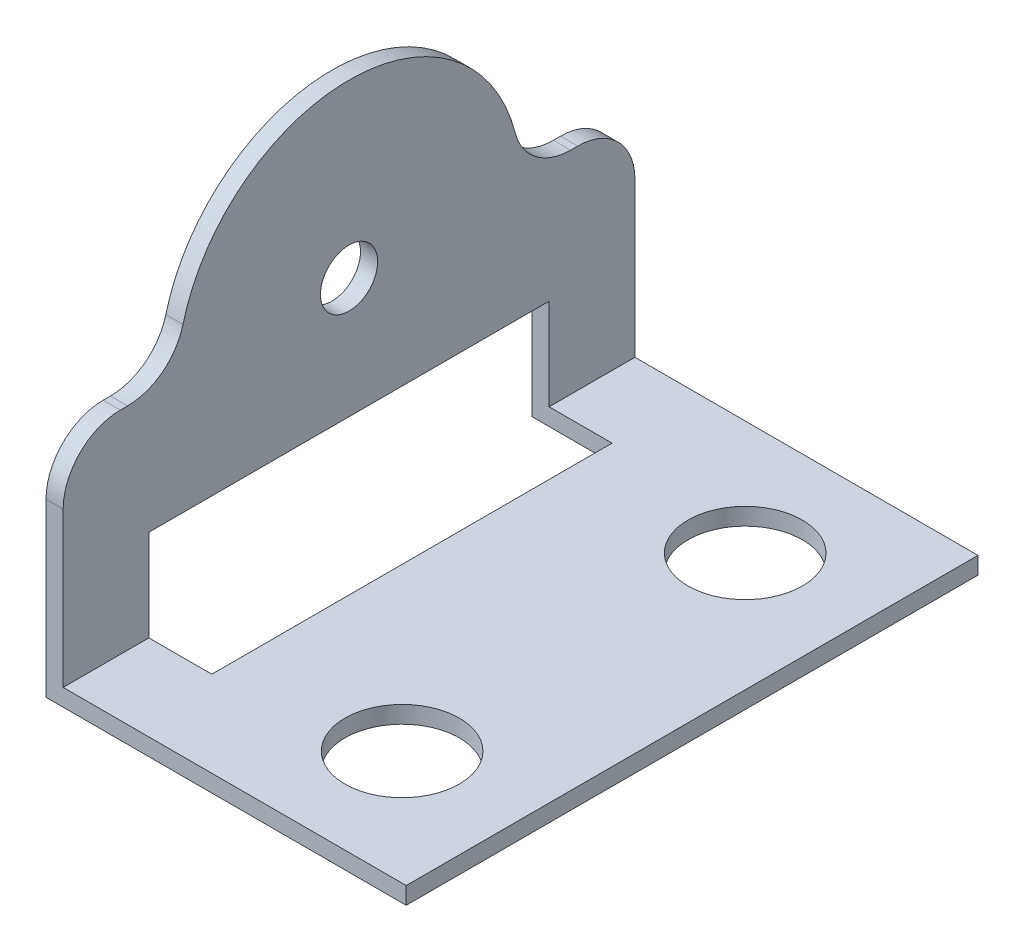
ISO-10303-21;
HEADER;
FILE_DESCRIPTION(('STEP AP214'),'2;1');
FILE_NAME('part.step','',(''),(''),'','','');
FILE_SCHEMA(('AUTOMOTIVE_DESIGN { 1 0 10303 214 1 1 1 1 }'));
ENDSEC;
DATA;
#1=APPLICATION_CONTEXT('core data for automotive mechanical design processes');
#2=APPLICATION_PROTOCOL_DEFINITION('international standard','automotive_design',2000,#1);
#3=PRODUCT_CONTEXT('',#1,'mechanical');
#4=PRODUCT('Part','Part','',(#3));
#5=PRODUCT_RELATED_PRODUCT_CATEGORY('part','',(#4));
#6=PRODUCT_DEFINITION_FORMATION('','',#4);
#7=PRODUCT_DEFINITION_CONTEXT('part definition',#1,'design');
#8=PRODUCT_DEFINITION('design','',#6,#7);
#9=PRODUCT_DEFINITION_SHAPE('','',#8);
#10=(LENGTH_UNIT() NAMED_UNIT(*) SI_UNIT(.MILLI.,.METRE.));
#11=(NAMED_UNIT(*) PLANE_ANGLE_UNIT() SI_UNIT($,.RADIAN.));
#12=(NAMED_UNIT(*) SI_UNIT($,.STERADIAN.) SOLID_ANGLE_UNIT());
#13=UNCERTAINTY_MEASURE_WITH_UNIT(LENGTH_MEASURE(1.E-05),#10,'distance_accuracy_value','');
#14=(GEOMETRIC_REPRESENTATION_CONTEXT(3) GLOBAL_UNCERTAINTY_ASSIGNED_CONTEXT((#13)) GLOBAL_UNIT_ASSIGNED_CONTEXT((#10,
#11,#12)) REPRESENTATION_CONTEXT('',''));
#15=CARTESIAN_POINT('',(0.,0.,0.));
#16=DIRECTION('',(0.,0.,1.));
#17=DIRECTION('',(1.,0.,0.));
#18=AXIS2_PLACEMENT_3D('',#15,#16,#17);
#19=CARTESIAN_POINT('',(0.,0.,0.));
#20=DIRECTION('',(1.,0.,0.));
#21=DIRECTION('',(0.,0.,-1.));
#22=AXIS2_PLACEMENT_3D('',#19,#20,#21);
#23=PLANE('',#22);
#24=CARTESIAN_POINT('',(0.,0.,0.));
#25=DIRECTION('',(1.,0.,0.));
#26=DIRECTION('',(0.,0.,-1.));
#27=AXIS2_PLACEMENT_3D('',#24,#25,#26);
#28=CIRCLE('',#27,2.5);
#29=CARTESIAN_POINT('',(0.,0.,-2.5));
#30=VERTEX_POINT('',#29);
#31=EDGE_CURVE('E266',#30,#30,#28,.T.);
#32=ORIENTED_EDGE('',*,*,#31,.F.);
#33=EDGE_LOOP('',(#32));
#34=FACE_BOUND('',#33,.T.);
#35=DIRECTION('',(0.,-1.,0.));
#36=VECTOR('',#35,1.);
#37=CARTESIAN_POINT('',(0.,0.,-25.));
#38=LINE('',#37,#36);
#39=CARTESIAN_POINT('',(0.,-5.,-25.));
#40=VERTEX_POINT('',#39);
#41=CARTESIAN_POINT('',(0.,-18.5,-25.));
#42=VERTEX_POINT('',#41);
#43=EDGE_CURVE('E233',#40,#42,#38,.T.);
#44=ORIENTED_EDGE('',*,*,#43,.F.);
#45=CARTESIAN_POINT('',(0.,-5.,-20.));
#46=DIRECTION('',(1.,0.,0.));
#47=DIRECTION('',(0.,0.,-1.));
#48=AXIS2_PLACEMENT_3D('',#45,#46,#47);
#49=CIRCLE('',#48,5.);
#50=CARTESIAN_POINT('',(0.,0.,-20.));
#51=VERTEX_POINT('',#50);
#52=EDGE_CURVE('E293',#40,#51,#49,.T.);
#53=ORIENTED_EDGE('',*,*,#52,.T.);
#54=DIRECTION('',(0.,0.,1.));
#55=VECTOR('',#54,1.);
#56=CARTESIAN_POINT('',(0.,0.,0.));
#57=LINE('',#56,#55);
#58=CARTESIAN_POINT('',(0.,0.,-19.3649167310371));
#59=VERTEX_POINT('',#58);
#60=EDGE_CURVE('E269',#51,#59,#57,.T.);
#61=ORIENTED_EDGE('',*,*,#60,.T.);
#62=CARTESIAN_POINT('',(0.,5.,-19.3649167310371));
#63=DIRECTION('',(1.,0.,0.));
#64=DIRECTION('',(0.,0.,-1.));
#65=AXIS2_PLACEMENT_3D('',#62,#63,#64);
#66=CIRCLE('',#65,5.);
#67=CARTESIAN_POINT('',(0.,3.75,-14.5236875482778));
#68=VERTEX_POINT('',#67);
#69=EDGE_CURVE('E315',#59,#68,#66,.F.);
#70=ORIENTED_EDGE('',*,*,#69,.T.);
#71=CARTESIAN_POINT('',(0.,0.,0.));
#72=DIRECTION('',(1.,0.,0.));
#73=DIRECTION('',(0.,0.,-1.));
#74=AXIS2_PLACEMENT_3D('',#71,#72,#73);
#75=CIRCLE('',#74,15.);
#76=CARTESIAN_POINT('',(0.,3.75,14.5236875482778));
#77=VERTEX_POINT('',#76);
#78=EDGE_CURVE('E272',#68,#77,#75,.T.);
#79=ORIENTED_EDGE('',*,*,#78,.T.);
#80=CARTESIAN_POINT('',(0.,5.,19.3649167310371));
#81=DIRECTION('',(1.,0.,0.));
#82=DIRECTION('',(0.,0.,-1.));
#83=AXIS2_PLACEMENT_3D('',#80,#81,#82);
#84=CIRCLE('',#83,5.);
#85=CARTESIAN_POINT('',(0.,0.,19.3649167310371));
#86=VERTEX_POINT('',#85);
#87=EDGE_CURVE('E43',#77,#86,#84,.F.);
#88=ORIENTED_EDGE('',*,*,#87,.T.);
#89=DIRECTION('',(0.,0.,1.));
#90=VECTOR('',#89,1.);
#91=CARTESIAN_POINT('',(0.,0.,0.));
#92=LINE('',#91,#90);
#93=CARTESIAN_POINT('',(0.,0.,20.));
#94=VERTEX_POINT('',#93);
#95=EDGE_CURVE('E275',#86,#94,#92,.T.);
#96=ORIENTED_EDGE('',*,*,#95,.T.);
#97=CARTESIAN_POINT('',(0.,-5.,20.));
#98=DIRECTION('',(1.,0.,0.));
#99=DIRECTION('',(0.,0.,-1.));
#100=AXIS2_PLACEMENT_3D('',#97,#98,#99);
#101=CIRCLE('',#100,5.);
#102=CARTESIAN_POINT('',(0.,-5.,25.));
#103=VERTEX_POINT('',#102);
#104=EDGE_CURVE('E291',#94,#103,#101,.T.);
#105=ORIENTED_EDGE('',*,*,#104,.T.);
#106=DIRECTION('',(0.,-1.,0.));
#107=VECTOR('',#106,1.);
#108=CARTESIAN_POINT('',(0.,0.,25.));
#109=LINE('',#108,#107);
#110=CARTESIAN_POINT('',(0.,-18.5,25.));
#111=VERTEX_POINT('',#110);
#112=EDGE_CURVE('E278',#103,#111,#109,.T.);
#113=ORIENTED_EDGE('',*,*,#112,.T.);
#114=DIRECTION('',(0.,0.,-1.));
#115=VECTOR('',#114,1.);
#116=CARTESIAN_POINT('',(0.,-18.5,0.));
#117=LINE('',#116,#115);
#118=CARTESIAN_POINT('',(0.,-18.5,17.5));
#119=VERTEX_POINT('',#118);
#120=EDGE_CURVE('E208',#111,#119,#117,.T.);
#121=ORIENTED_EDGE('',*,*,#120,.T.);
#122=DIRECTION('',(0.,1.,0.));
#123=VECTOR('',#122,1.);
#124=CARTESIAN_POINT('',(0.,0.,17.5));
#125=LINE('',#124,#123);
#126=CARTESIAN_POINT('',(0.,-10.5,17.5));
#127=VERTEX_POINT('',#126);
#128=EDGE_CURVE('E179',#119,#127,#125,.T.);
#129=ORIENTED_EDGE('',*,*,#128,.T.);
#130=DIRECTION('',(0.,0.,-1.));
#131=VECTOR('',#130,1.);
#132=CARTESIAN_POINT('',(0.,-10.5,0.));
#133=LINE('',#132,#131);
#134=CARTESIAN_POINT('',(0.,-10.5,-17.5));
#135=VERTEX_POINT('',#134);
#136=EDGE_CURVE('E260',#127,#135,#133,.T.);
#137=ORIENTED_EDGE('',*,*,#136,.T.);
#138=DIRECTION('',(0.,1.,0.));
#139=VECTOR('',#138,1.);
#140=CARTESIAN_POINT('',(0.,0.,-17.5));
#141=LINE('',#140,#139);
#142=CARTESIAN_POINT('',(0.,-18.5,-17.5));
#143=VERTEX_POINT('',#142);
#144=EDGE_CURVE('E263',#143,#135,#141,.T.);
#145=ORIENTED_EDGE('',*,*,#144,.F.);
#146=EDGE_CURVE('E223',#143,#42,#117,.T.);
#147=ORIENTED_EDGE('',*,*,#146,.T.);
#148=EDGE_LOOP('',(#44,#53,#61,#70,#79,#88,#96,#105,#113,#121,#129,#137,#145,#147));
#149=FACE_BOUND('',#148,.T.);
#150=ADVANCED_FACE('F35',(#34,#149),#23,.T.);
#151=CARTESIAN_POINT('',(-1.5,0.,0.));
#152=DIRECTION('',(0.,1.,0.));
#153=DIRECTION('',(0.,0.,1.));
#154=AXIS2_PLACEMENT_3D('',#151,#152,#153);
#155=PLANE('',#154);
#156=ORIENTED_EDGE('',*,*,#60,.F.);
#157=DIRECTION('',(1.,0.,0.));
#158=VECTOR('',#157,1.);
#159=CARTESIAN_POINT('',(-1.5,0.,-20.));
#160=LINE('',#159,#158);
#161=CARTESIAN_POINT('',(-1.5,0.,-20.));
#162=VERTEX_POINT('',#161);
#163=EDGE_CURVE('E298',#51,#162,#160,.F.);
#164=ORIENTED_EDGE('',*,*,#163,.T.);
#165=DIRECTION('',(0.,0.,1.));
#166=VECTOR('',#165,1.);
#167=CARTESIAN_POINT('',(-1.5,0.,0.));
#168=LINE('',#167,#166);
#169=CARTESIAN_POINT('',(-1.5,0.,-19.3649167310371));
#170=VERTEX_POINT('',#169);
#171=EDGE_CURVE('E241',#162,#170,#168,.T.);
#172=ORIENTED_EDGE('',*,*,#171,.T.);
#173=DIRECTION('',(-1.,0.,0.));
#174=VECTOR('',#173,1.);
#175=CARTESIAN_POINT('',(0.,0.,-19.3649167310371));
#176=LINE('',#175,#174);
#177=EDGE_CURVE('E295',#170,#59,#176,.F.);
#178=ORIENTED_EDGE('',*,*,#177,.T.);
#179=EDGE_LOOP('',(#156,#164,#172,#178));
#180=FACE_BOUND('',#179,.T.);
#181=ADVANCED_FACE('F337',(#180),#155,.T.);
#182=CARTESIAN_POINT('',(-1.5,0.,-25.));
#183=DIRECTION('',(0.,0.,1.));
#184=DIRECTION('',(0.,-1.,0.));
#185=AXIS2_PLACEMENT_3D('',#182,#183,#184);
#186=PLANE('',#185);
#187=DIRECTION('',(0.,-1.,0.));
#188=VECTOR('',#187,1.);
#189=CARTESIAN_POINT('',(-1.5,0.,-25.));
#190=LINE('',#189,#188);
#191=CARTESIAN_POINT('',(-1.5,-5.,-25.));
#192=VERTEX_POINT('',#191);
#193=CARTESIAN_POINT('',(-1.5,-20.,-25.));
#194=VERTEX_POINT('',#193);
#195=EDGE_CURVE('E256',#192,#194,#190,.T.);
#196=ORIENTED_EDGE('',*,*,#195,.F.);
#197=DIRECTION('',(1.,0.,0.));
#198=VECTOR('',#197,1.);
#199=CARTESIAN_POINT('',(0.,-5.,-25.));
#200=LINE('',#199,#198);
#201=EDGE_CURVE('E288',#192,#40,#200,.T.);
#202=ORIENTED_EDGE('',*,*,#201,.T.);
#203=ORIENTED_EDGE('',*,*,#43,.T.);
#204=DIRECTION('',(-1.,0.,0.));
#205=VECTOR('',#204,1.);
#206=CARTESIAN_POINT('',(30.,-18.5,-25.));
#207=LINE('',#206,#205);
#208=CARTESIAN_POINT('',(30.,-18.5,-25.));
#209=VERTEX_POINT('',#208);
#210=EDGE_CURVE('E221',#209,#42,#207,.T.);
#211=ORIENTED_EDGE('',*,*,#210,.F.);
#212=DIRECTION('',(0.,-1.,0.));
#213=VECTOR('',#212,1.);
#214=CARTESIAN_POINT('',(30.,0.,-25.));
#215=LINE('',#214,#213);
#216=CARTESIAN_POINT('',(30.,-20.,-25.));
#217=VERTEX_POINT('',#216);
#218=EDGE_CURVE('E218',#209,#217,#215,.T.);
#219=ORIENTED_EDGE('',*,*,#218,.T.);
#220=DIRECTION('',(1.,0.,0.));
#221=VECTOR('',#220,1.);
#222=CARTESIAN_POINT('',(-1.5,-20.,-25.));
#223=LINE('',#222,#221);
#224=EDGE_CURVE('E281',#194,#217,#223,.T.);
#225=ORIENTED_EDGE('',*,*,#224,.F.);
#226=EDGE_LOOP('',(#196,#202,#203,#211,#219,#225));
#227=FACE_BOUND('',#226,.T.);
#228=ADVANCED_FACE('F346',(#227),#186,.F.);
#229=CARTESIAN_POINT('',(-1.5,-20.,0.));
#230=DIRECTION('',(0.,1.,0.));
#231=DIRECTION('',(0.,0.,1.));
#232=AXIS2_PLACEMENT_3D('',#229,#230,#231);
#233=PLANE('',#232);
#234=CARTESIAN_POINT('',(19.6422772834224,-20.,15.));
#235=DIRECTION('',(0.,1.,0.));
#236=DIRECTION('',(0.,0.,1.));
#237=AXIS2_PLACEMENT_3D('',#234,#235,#236);
#238=CIRCLE('',#237,5.);
#239=CARTESIAN_POINT('',(19.6422772834224,-20.,20.));
#240=VERTEX_POINT('',#239);
#241=EDGE_CURVE('E204',#240,#240,#238,.T.);
#242=ORIENTED_EDGE('',*,*,#241,.T.);
#243=EDGE_LOOP('',(#242));
#244=FACE_BOUND('',#243,.T.);
#245=CARTESIAN_POINT('',(19.6422772834224,-20.,-15.));
#246=DIRECTION('',(0.,1.,0.));
#247=DIRECTION('',(0.,0.,1.));
#248=AXIS2_PLACEMENT_3D('',#245,#246,#247);
#249=CIRCLE('',#248,5.);
#250=CARTESIAN_POINT('',(19.6422772834224,-20.,-10.));
#251=VERTEX_POINT('',#250);
#252=EDGE_CURVE('E201',#251,#251,#249,.T.);
#253=ORIENTED_EDGE('',*,*,#252,.T.);
#254=EDGE_LOOP('',(#253));
#255=FACE_BOUND('',#254,.T.);
#256=DIRECTION('',(0.,0.,1.));
#257=VECTOR('',#256,1.);
#258=CARTESIAN_POINT('',(-1.5,-20.,0.));
#259=LINE('',#258,#257);
#260=CARTESIAN_POINT('',(-1.5,-20.,17.5));
#261=VERTEX_POINT('',#260);
#262=CARTESIAN_POINT('',(-1.5,-20.,25.));
#263=VERTEX_POINT('',#262);
#264=EDGE_CURVE('E252',#261,#263,#259,.T.);
#265=ORIENTED_EDGE('',*,*,#264,.F.);
#266=DIRECTION('',(1.,0.,0.));
#267=VECTOR('',#266,1.);
#268=CARTESIAN_POINT('',(-1.5,-20.,17.5));
#269=LINE('',#268,#267);
#270=CARTESIAN_POINT('',(5.5,-20.,17.5));
#271=VERTEX_POINT('',#270);
#272=EDGE_CURVE('E199',#261,#271,#269,.T.);
#273=ORIENTED_EDGE('',*,*,#272,.T.);
#274=DIRECTION('',(0.,0.,-1.));
#275=VECTOR('',#274,1.);
#276=CARTESIAN_POINT('',(5.5,-20.,0.));
#277=LINE('',#276,#275);
#278=CARTESIAN_POINT('',(5.5,-20.,-17.5));
#279=VERTEX_POINT('',#278);
#280=EDGE_CURVE('E168',#271,#279,#277,.T.);
#281=ORIENTED_EDGE('',*,*,#280,.T.);
#282=DIRECTION('',(1.,0.,0.));
#283=VECTOR('',#282,1.);
#284=CARTESIAN_POINT('',(-1.5,-20.,-17.5));
#285=LINE('',#284,#283);
#286=CARTESIAN_POINT('',(-1.5,-20.,-17.5));
#287=VERTEX_POINT('',#286);
#288=EDGE_CURVE('E191',#287,#279,#285,.T.);
#289=ORIENTED_EDGE('',*,*,#288,.F.);
#290=EDGE_CURVE('E253',#194,#287,#259,.T.);
#291=ORIENTED_EDGE('',*,*,#290,.F.);
#292=ORIENTED_EDGE('',*,*,#224,.T.);
#293=DIRECTION('',(0.,0.,1.));
#294=VECTOR('',#293,1.);
#295=CARTESIAN_POINT('',(30.,-20.,0.));
#296=LINE('',#295,#294);
#297=CARTESIAN_POINT('',(30.,-20.,25.));
#298=VERTEX_POINT('',#297);
#299=EDGE_CURVE('E215',#217,#298,#296,.T.);
#300=ORIENTED_EDGE('',*,*,#299,.T.);
#301=DIRECTION('',(1.,0.,0.));
#302=VECTOR('',#301,1.);
#303=CARTESIAN_POINT('',(-1.5,-20.,25.));
#304=LINE('',#303,#302);
#305=EDGE_CURVE('E283',#263,#298,#304,.T.);
#306=ORIENTED_EDGE('',*,*,#305,.F.);
#307=EDGE_LOOP('',(#265,#273,#281,#289,#291,#292,#300,#306));
#308=FACE_BOUND('',#307,.T.);
#309=ADVANCED_FACE('F352',(#244,#255,#308),#233,.F.);
#310=CARTESIAN_POINT('',(-1.5,0.,25.));
#311=DIRECTION('',(0.,0.,1.));
#312=DIRECTION('',(0.,-1.,0.));
#313=AXIS2_PLACEMENT_3D('',#310,#311,#312);
#314=PLANE('',#313);
#315=ORIENTED_EDGE('',*,*,#112,.F.);
#316=DIRECTION('',(1.,0.,0.));
#317=VECTOR('',#316,1.);
#318=CARTESIAN_POINT('',(-1.5,-5.,25.));
#319=LINE('',#318,#317);
#320=CARTESIAN_POINT('',(-1.5,-5.,25.));
#321=VERTEX_POINT('',#320);
#322=EDGE_CURVE('E309',#103,#321,#319,.F.);
#323=ORIENTED_EDGE('',*,*,#322,.T.);
#324=DIRECTION('',(0.,-1.,0.));
#325=VECTOR('',#324,1.);
#326=CARTESIAN_POINT('',(-1.5,0.,25.));
#327=LINE('',#326,#325);
#328=EDGE_CURVE('E249',#321,#263,#327,.T.);
#329=ORIENTED_EDGE('',*,*,#328,.T.);
#330=ORIENTED_EDGE('',*,*,#305,.T.);
#331=DIRECTION('',(0.,-1.,0.));
#332=VECTOR('',#331,1.);
#333=CARTESIAN_POINT('',(30.,0.,25.));
#334=LINE('',#333,#332);
#335=CARTESIAN_POINT('',(30.,-18.5,25.));
#336=VERTEX_POINT('',#335);
#337=EDGE_CURVE('E212',#336,#298,#334,.T.);
#338=ORIENTED_EDGE('',*,*,#337,.F.);
#339=DIRECTION('',(-1.,0.,0.));
#340=VECTOR('',#339,1.);
#341=CARTESIAN_POINT('',(30.,-18.5,25.));
#342=LINE('',#341,#340);
#343=EDGE_CURVE('E226',#336,#111,#342,.T.);
#344=ORIENTED_EDGE('',*,*,#343,.T.);
#345=EDGE_LOOP('',(#315,#323,#329,#330,#338,#344));
#346=FACE_BOUND('',#345,.T.);
#347=ADVANCED_FACE('F365',(#346),#314,.T.);
#348=CARTESIAN_POINT('',(-1.5,0.,0.));
#349=DIRECTION('',(0.,1.,0.));
#350=DIRECTION('',(0.,0.,1.));
#351=AXIS2_PLACEMENT_3D('',#348,#349,#350);
#352=PLANE('',#351);
#353=DIRECTION('',(0.,0.,1.));
#354=VECTOR('',#353,1.);
#355=CARTESIAN_POINT('',(-1.5,0.,0.));
#356=LINE('',#355,#354);
#357=CARTESIAN_POINT('',(-1.5,0.,19.3649167310371));
#358=VERTEX_POINT('',#357);
#359=CARTESIAN_POINT('',(-1.5,0.,20.));
#360=VERTEX_POINT('',#359);
#361=EDGE_CURVE('E246',#358,#360,#356,.T.);
#362=ORIENTED_EDGE('',*,*,#361,.T.);
#363=DIRECTION('',(1.,0.,0.));
#364=VECTOR('',#363,1.);
#365=CARTESIAN_POINT('',(-1.5,0.,20.));
#366=LINE('',#365,#364);
#367=EDGE_CURVE('E306',#360,#94,#366,.T.);
#368=ORIENTED_EDGE('',*,*,#367,.T.);
#369=ORIENTED_EDGE('',*,*,#95,.F.);
#370=DIRECTION('',(-1.,0.,0.));
#371=VECTOR('',#370,1.);
#372=CARTESIAN_POINT('',(-1.5,0.,19.3649167310371));
#373=LINE('',#372,#371);
#374=EDGE_CURVE('E304',#86,#358,#373,.T.);
#375=ORIENTED_EDGE('',*,*,#374,.T.);
#376=EDGE_LOOP('',(#362,#368,#369,#375));
#377=FACE_BOUND('',#376,.T.);
#378=ADVANCED_FACE('F325',(#377),#352,.T.);
#379=CARTESIAN_POINT('',(-1.5,-18.5,0.));
#380=DIRECTION('',(0.,-1.,0.));
#381=DIRECTION('',(0.,0.,-1.));
#382=AXIS2_PLACEMENT_3D('',#379,#380,#381);
#383=PLANE('',#382);
#384=DIRECTION('',(0.,0.,-1.));
#385=VECTOR('',#384,1.);
#386=CARTESIAN_POINT('',(5.5,-18.5,17.5));
#387=LINE('',#386,#385);
#388=CARTESIAN_POINT('',(5.5,-18.5,17.5));
#389=VERTEX_POINT('',#388);
#390=CARTESIAN_POINT('',(5.5,-18.5,-17.5));
#391=VERTEX_POINT('',#390);
#392=EDGE_CURVE('E165',#389,#391,#387,.T.);
#393=ORIENTED_EDGE('',*,*,#392,.F.);
#394=DIRECTION('',(1.,0.,0.));
#395=VECTOR('',#394,1.);
#396=CARTESIAN_POINT('',(-1.5,-18.5,17.5));
#397=LINE('',#396,#395);
#398=EDGE_CURVE('E176',#119,#389,#397,.T.);
#399=ORIENTED_EDGE('',*,*,#398,.F.);
#400=ORIENTED_EDGE('',*,*,#120,.F.);
#401=ORIENTED_EDGE('',*,*,#343,.F.);
#402=DIRECTION('',(0.,0.,-1.));
#403=VECTOR('',#402,1.);
#404=CARTESIAN_POINT('',(30.,-18.5,0.));
#405=LINE('',#404,#403);
#406=EDGE_CURVE('E209',#336,#209,#405,.T.);
#407=ORIENTED_EDGE('',*,*,#406,.T.);
#408=ORIENTED_EDGE('',*,*,#210,.T.);
#409=ORIENTED_EDGE('',*,*,#146,.F.);
#410=DIRECTION('',(1.,0.,0.));
#411=VECTOR('',#410,1.);
#412=CARTESIAN_POINT('',(-1.5,-18.5,-17.5));
#413=LINE('',#412,#411);
#414=EDGE_CURVE('E173',#143,#391,#413,.T.);
#415=ORIENTED_EDGE('',*,*,#414,.T.);
#416=EDGE_LOOP('',(#393,#399,#400,#401,#407,#408,#409,#415));
#417=FACE_BOUND('',#416,.T.);
#418=CARTESIAN_POINT('',(19.6422772834224,-18.5,15.));
#419=DIRECTION('',(0.,1.,0.));
#420=DIRECTION('',(0.,0.,1.));
#421=AXIS2_PLACEMENT_3D('',#418,#419,#420);
#422=CIRCLE('',#421,5.);
#423=CARTESIAN_POINT('',(19.6422772834224,-18.5,20.));
#424=VERTEX_POINT('',#423);
#425=EDGE_CURVE('E183',#424,#424,#422,.T.);
#426=ORIENTED_EDGE('',*,*,#425,.F.);
#427=EDGE_LOOP('',(#426));
#428=FACE_BOUND('',#427,.T.);
#429=CARTESIAN_POINT('',(19.6422772834224,-18.5,-15.));
#430=DIRECTION('',(0.,1.,0.));
#431=DIRECTION('',(0.,0.,1.));
#432=AXIS2_PLACEMENT_3D('',#429,#430,#431);
#433=CIRCLE('',#432,5.);
#434=CARTESIAN_POINT('',(19.6422772834224,-18.5,-10.));
#435=VERTEX_POINT('',#434);
#436=EDGE_CURVE('E195',#435,#435,#433,.T.);
#437=ORIENTED_EDGE('',*,*,#436,.F.);
#438=EDGE_LOOP('',(#437));
#439=FACE_BOUND('',#438,.T.);
#440=ADVANCED_FACE('F185',(#417,#428,#439),#383,.F.);
#441=CARTESIAN_POINT('',(-1.5,0.,-17.5));
#442=DIRECTION('',(0.,0.,-1.));
#443=DIRECTION('',(-1.,0.,0.));
#444=AXIS2_PLACEMENT_3D('',#441,#442,#443);
#445=PLANE('',#444);
#446=ORIENTED_EDGE('',*,*,#144,.T.);
#447=DIRECTION('',(1.,0.,0.));
#448=VECTOR('',#447,1.);
#449=CARTESIAN_POINT('',(-1.5,-10.5,-17.5));
#450=LINE('',#449,#448);
#451=CARTESIAN_POINT('',(-1.5,-10.5,-17.5));
#452=VERTEX_POINT('',#451);
#453=EDGE_CURVE('E285',#452,#135,#450,.T.);
#454=ORIENTED_EDGE('',*,*,#453,.F.);
#455=DIRECTION('',(0.,1.,0.));
#456=VECTOR('',#455,1.);
#457=CARTESIAN_POINT('',(-1.5,0.,-17.5));
#458=LINE('',#457,#456);
#459=EDGE_CURVE('E236',#287,#452,#458,.T.);
#460=ORIENTED_EDGE('',*,*,#459,.F.);
#461=ORIENTED_EDGE('',*,*,#288,.T.);
#462=DIRECTION('',(0.,1.,0.));
#463=VECTOR('',#462,1.);
#464=CARTESIAN_POINT('',(5.5,-48.5,-17.5));
#465=LINE('',#464,#463);
#466=EDGE_CURVE('E172',#279,#391,#465,.T.);
#467=ORIENTED_EDGE('',*,*,#466,.T.);
#468=ORIENTED_EDGE('',*,*,#414,.F.);
#469=EDGE_LOOP('',(#446,#454,#460,#461,#467,#468));
#470=FACE_BOUND('',#469,.T.);
#471=ADVANCED_FACE('F355',(#470),#445,.F.);
#472=CARTESIAN_POINT('',(-1.5,-10.5,0.));
#473=DIRECTION('',(0.,-1.,0.));
#474=DIRECTION('',(0.,0.,-1.));
#475=AXIS2_PLACEMENT_3D('',#472,#473,#474);
#476=PLANE('',#475);
#477=ORIENTED_EDGE('',*,*,#136,.F.);
#478=DIRECTION('',(1.,0.,0.));
#479=VECTOR('',#478,1.);
#480=CARTESIAN_POINT('',(-1.5,-10.5,17.5));
#481=LINE('',#480,#479);
#482=CARTESIAN_POINT('',(-1.5,-10.5,17.5));
#483=VERTEX_POINT('',#482);
#484=EDGE_CURVE('E258',#483,#127,#481,.T.);
#485=ORIENTED_EDGE('',*,*,#484,.F.);
#486=DIRECTION('',(0.,0.,-1.));
#487=VECTOR('',#486,1.);
#488=CARTESIAN_POINT('',(-1.5,-10.5,0.));
#489=LINE('',#488,#487);
#490=EDGE_CURVE('E232',#483,#452,#489,.T.);
#491=ORIENTED_EDGE('',*,*,#490,.T.);
#492=ORIENTED_EDGE('',*,*,#453,.T.);
#493=EDGE_LOOP('',(#477,#485,#491,#492));
#494=FACE_BOUND('',#493,.T.);
#495=ADVANCED_FACE('F406',(#494),#476,.T.);
#496=CARTESIAN_POINT('',(-1.5,0.,0.));
#497=DIRECTION('',(1.,0.,0.));
#498=DIRECTION('',(0.,0.,-1.));
#499=AXIS2_PLACEMENT_3D('',#496,#497,#498);
#500=CYLINDRICAL_SURFACE('',#499,2.5);
#501=CARTESIAN_POINT('',(-1.5,0.,0.));
#502=DIRECTION('',(1.,0.,0.));
#503=DIRECTION('',(0.,0.,-1.));
#504=AXIS2_PLACEMENT_3D('',#501,#502,#503);
#505=CIRCLE('',#504,2.5);
#506=CARTESIAN_POINT('',(-1.5,0.,-2.5));
#507=VERTEX_POINT('',#506);
#508=EDGE_CURVE('E238',#507,#507,#505,.T.);
#509=ORIENTED_EDGE('',*,*,#508,.F.);
#510=EDGE_LOOP('',(#509));
#511=FACE_BOUND('',#510,.T.);
#512=ORIENTED_EDGE('',*,*,#31,.T.);
#513=EDGE_LOOP('',(#512));
#514=FACE_BOUND('',#513,.T.);
#515=ADVANCED_FACE('F403',(#511,#514),#500,.F.);
#516=CARTESIAN_POINT('',(-1.5,0.,17.5));
#517=DIRECTION('',(0.,0.,-1.));
#518=DIRECTION('',(-1.,0.,0.));
#519=AXIS2_PLACEMENT_3D('',#516,#517,#518);
#520=PLANE('',#519);
#521=ORIENTED_EDGE('',*,*,#128,.F.);
#522=ORIENTED_EDGE('',*,*,#398,.T.);
#523=DIRECTION('',(0.,1.,0.));
#524=VECTOR('',#523,1.);
#525=CARTESIAN_POINT('',(5.5,-48.5,17.5));
#526=LINE('',#525,#524);
#527=EDGE_CURVE('E160',#271,#389,#526,.T.);
#528=ORIENTED_EDGE('',*,*,#527,.F.);
#529=ORIENTED_EDGE('',*,*,#272,.F.);
#530=DIRECTION('',(0.,1.,0.));
#531=VECTOR('',#530,1.);
#532=CARTESIAN_POINT('',(-1.5,0.,17.5));
#533=LINE('',#532,#531);
#534=EDGE_CURVE('E229',#261,#483,#533,.T.);
#535=ORIENTED_EDGE('',*,*,#534,.T.);
#536=ORIENTED_EDGE('',*,*,#484,.T.);
#537=EDGE_LOOP('',(#521,#522,#528,#529,#535,#536));
#538=FACE_BOUND('',#537,.T.);
#539=ADVANCED_FACE('F177',(#538),#520,.T.);
#540=CARTESIAN_POINT('',(-1.5,0.,0.));
#541=DIRECTION('',(1.,0.,0.));
#542=DIRECTION('',(0.,0.,-1.));
#543=AXIS2_PLACEMENT_3D('',#540,#541,#542);
#544=CYLINDRICAL_SURFACE('',#543,15.);
#545=ORIENTED_EDGE('',*,*,#78,.F.);
#546=DIRECTION('',(1.,0.,0.));
#547=VECTOR('',#546,1.);
#548=CARTESIAN_POINT('',(-1.5,3.75,-14.5236875482778));
#549=LINE('',#548,#547);
#550=CARTESIAN_POINT('',(-1.5,3.75,-14.5236875482778));
#551=VERTEX_POINT('',#550);
#552=EDGE_CURVE('E55',#68,#551,#549,.F.);
#553=ORIENTED_EDGE('',*,*,#552,.T.);
#554=CARTESIAN_POINT('',(-1.5,0.,0.));
#555=DIRECTION('',(1.,0.,0.));
#556=DIRECTION('',(0.,0.,-1.));
#557=AXIS2_PLACEMENT_3D('',#554,#555,#556);
#558=CIRCLE('',#557,15.);
#559=CARTESIAN_POINT('',(-1.5,3.75,14.5236875482778));
#560=VERTEX_POINT('',#559);
#561=EDGE_CURVE('E244',#551,#560,#558,.T.);
#562=ORIENTED_EDGE('',*,*,#561,.T.);
#563=DIRECTION('',(1.,0.,0.));
#564=VECTOR('',#563,1.);
#565=CARTESIAN_POINT('',(-1.5,3.75,14.5236875482778));
#566=LINE('',#565,#564);
#567=EDGE_CURVE('E311',#560,#77,#566,.T.);
#568=ORIENTED_EDGE('',*,*,#567,.T.);
#569=EDGE_LOOP('',(#545,#553,#562,#568));
#570=FACE_BOUND('',#569,.T.);
#571=ADVANCED_FACE('F327',(#570),#544,.T.);
#572=CARTESIAN_POINT('',(-1.5,0.,0.));
#573=DIRECTION('',(1.,0.,0.));
#574=DIRECTION('',(0.,0.,-1.));
#575=AXIS2_PLACEMENT_3D('',#572,#573,#574);
#576=PLANE('',#575);
#577=ORIENTED_EDGE('',*,*,#534,.F.);
#578=ORIENTED_EDGE('',*,*,#264,.T.);
#579=ORIENTED_EDGE('',*,*,#328,.F.);
#580=CARTESIAN_POINT('',(-1.5,-5.,20.));
#581=DIRECTION('',(1.,0.,0.));
#582=DIRECTION('',(0.,0.,-1.));
#583=AXIS2_PLACEMENT_3D('',#580,#581,#582);
#584=CIRCLE('',#583,5.);
#585=EDGE_CURVE('E300',#321,#360,#584,.F.);
#586=ORIENTED_EDGE('',*,*,#585,.T.);
#587=ORIENTED_EDGE('',*,*,#361,.F.);
#588=CARTESIAN_POINT('',(-1.5,5.,19.3649167310371));
#589=DIRECTION('',(1.,0.,0.));
#590=DIRECTION('',(0.,0.,-1.));
#591=AXIS2_PLACEMENT_3D('',#588,#589,#590);
#592=CIRCLE('',#591,5.);
#593=EDGE_CURVE('E11',#358,#560,#592,.T.);
#594=ORIENTED_EDGE('',*,*,#593,.T.);
#595=ORIENTED_EDGE('',*,*,#561,.F.);
#596=CARTESIAN_POINT('',(-1.5,5.,-19.3649167310371));
#597=DIRECTION('',(1.,0.,0.));
#598=DIRECTION('',(0.,0.,-1.));
#599=AXIS2_PLACEMENT_3D('',#596,#597,#598);
#600=CIRCLE('',#599,5.);
#601=EDGE_CURVE('E317',#551,#170,#600,.T.);
#602=ORIENTED_EDGE('',*,*,#601,.T.);
#603=ORIENTED_EDGE('',*,*,#171,.F.);
#604=CARTESIAN_POINT('',(-1.5,-5.,-20.));
#605=DIRECTION('',(1.,0.,0.));
#606=DIRECTION('',(0.,0.,-1.));
#607=AXIS2_PLACEMENT_3D('',#604,#605,#606);
#608=CIRCLE('',#607,5.);
#609=EDGE_CURVE('E302',#162,#192,#608,.F.);
#610=ORIENTED_EDGE('',*,*,#609,.T.);
#611=ORIENTED_EDGE('',*,*,#195,.T.);
#612=ORIENTED_EDGE('',*,*,#290,.T.);
#613=ORIENTED_EDGE('',*,*,#459,.T.);
#614=ORIENTED_EDGE('',*,*,#490,.F.);
#615=EDGE_LOOP('',(#577,#578,#579,#586,#587,#594,#595,#602,#603,#610,#611,#612,#613,#614));
#616=FACE_BOUND('',#615,.T.);
#617=ORIENTED_EDGE('',*,*,#508,.T.);
#618=EDGE_LOOP('',(#617));
#619=FACE_BOUND('',#618,.T.);
#620=ADVANCED_FACE('F329',(#616,#619),#576,.F.);
#621=CARTESIAN_POINT('',(30.,0.,0.));
#622=DIRECTION('',(1.,0.,0.));
#623=DIRECTION('',(0.,0.,-1.));
#624=AXIS2_PLACEMENT_3D('',#621,#622,#623);
#625=PLANE('',#624);
#626=ORIENTED_EDGE('',*,*,#406,.F.);
#627=ORIENTED_EDGE('',*,*,#337,.T.);
#628=ORIENTED_EDGE('',*,*,#299,.F.);
#629=ORIENTED_EDGE('',*,*,#218,.F.);
#630=EDGE_LOOP('',(#626,#627,#628,#629));
#631=FACE_BOUND('',#630,.T.);
#632=ADVANCED_FACE('F373',(#631),#625,.T.);
#633=CARTESIAN_POINT('',(-1.5,-5.,-20.));
#634=DIRECTION('',(-1.,0.,0.));
#635=DIRECTION('',(0.,0.,1.));
#636=AXIS2_PLACEMENT_3D('',#633,#634,#635);
#637=CYLINDRICAL_SURFACE('',#636,5.);
#638=ORIENTED_EDGE('',*,*,#609,.F.);
#639=ORIENTED_EDGE('',*,*,#163,.F.);
#640=ORIENTED_EDGE('',*,*,#52,.F.);
#641=ORIENTED_EDGE('',*,*,#201,.F.);
#642=EDGE_LOOP('',(#638,#639,#640,#641));
#643=FACE_BOUND('',#642,.T.);
#644=ADVANCED_FACE('F343',(#643),#637,.T.);
#645=CARTESIAN_POINT('',(-1.5,-5.,20.));
#646=DIRECTION('',(1.,0.,0.));
#647=DIRECTION('',(0.,0.,-1.));
#648=AXIS2_PLACEMENT_3D('',#645,#646,#647);
#649=CYLINDRICAL_SURFACE('',#648,5.);
#650=ORIENTED_EDGE('',*,*,#585,.F.);
#651=ORIENTED_EDGE('',*,*,#322,.F.);
#652=ORIENTED_EDGE('',*,*,#104,.F.);
#653=ORIENTED_EDGE('',*,*,#367,.F.);
#654=EDGE_LOOP('',(#650,#651,#652,#653));
#655=FACE_BOUND('',#654,.T.);
#656=ADVANCED_FACE('F369',(#655),#649,.T.);
#657=CARTESIAN_POINT('',(-1.5,5.,-19.3649167310371));
#658=DIRECTION('',(1.,0.,0.));
#659=DIRECTION('',(0.,0.,-1.));
#660=AXIS2_PLACEMENT_3D('',#657,#658,#659);
#661=CYLINDRICAL_SURFACE('',#660,5.);
#662=ORIENTED_EDGE('',*,*,#601,.F.);
#663=ORIENTED_EDGE('',*,*,#552,.F.);
#664=ORIENTED_EDGE('',*,*,#69,.F.);
#665=ORIENTED_EDGE('',*,*,#177,.F.);
#666=EDGE_LOOP('',(#662,#663,#664,#665));
#667=FACE_BOUND('',#666,.T.);
#668=ADVANCED_FACE('F334',(#667),#661,.F.);
#669=CARTESIAN_POINT('',(-1.5,5.,19.3649167310371));
#670=DIRECTION('',(1.,0.,0.));
#671=DIRECTION('',(0.,0.,-1.));
#672=AXIS2_PLACEMENT_3D('',#669,#670,#671);
#673=CYLINDRICAL_SURFACE('',#672,5.);
#674=ORIENTED_EDGE('',*,*,#593,.F.);
#675=ORIENTED_EDGE('',*,*,#374,.F.);
#676=ORIENTED_EDGE('',*,*,#87,.F.);
#677=ORIENTED_EDGE('',*,*,#567,.F.);
#678=EDGE_LOOP('',(#674,#675,#676,#677));
#679=FACE_BOUND('',#678,.T.);
#680=ADVANCED_FACE('F37',(#679),#673,.F.);
#681=CARTESIAN_POINT('',(5.5,-48.5,17.5));
#682=DIRECTION('',(1.,0.,0.));
#683=DIRECTION('',(0.,0.,-1.));
#684=AXIS2_PLACEMENT_3D('',#681,#682,#683);
#685=PLANE('',#684);
#686=ORIENTED_EDGE('',*,*,#527,.T.);
#687=ORIENTED_EDGE('',*,*,#392,.T.);
#688=ORIENTED_EDGE('',*,*,#466,.F.);
#689=ORIENTED_EDGE('',*,*,#280,.F.);
#690=EDGE_LOOP('',(#686,#687,#688,#689));
#691=FACE_BOUND('',#690,.T.);
#692=ADVANCED_FACE('F162',(#691),#685,.F.);
#693=CARTESIAN_POINT('',(19.6422772834224,-48.5,-15.));
#694=DIRECTION('',(0.,1.,0.));
#695=DIRECTION('',(0.,0.,1.));
#696=AXIS2_PLACEMENT_3D('',#693,#694,#695);
#697=CYLINDRICAL_SURFACE('',#696,5.);
#698=ORIENTED_EDGE('',*,*,#436,.T.);
#699=EDGE_LOOP('',(#698));
#700=FACE_BOUND('',#699,.T.);
#701=ORIENTED_EDGE('',*,*,#252,.F.);
#702=EDGE_LOOP('',(#701));
#703=FACE_BOUND('',#702,.T.);
#704=ADVANCED_FACE('F424',(#700,#703),#697,.F.);
#705=CARTESIAN_POINT('',(19.6422772834224,-48.5,15.));
#706=DIRECTION('',(0.,1.,0.));
#707=DIRECTION('',(0.,0.,1.));
#708=AXIS2_PLACEMENT_3D('',#705,#706,#707);
#709=CYLINDRICAL_SURFACE('',#708,5.);
#710=ORIENTED_EDGE('',*,*,#425,.T.);
#711=EDGE_LOOP('',(#710));
#712=FACE_BOUND('',#711,.T.);
#713=ORIENTED_EDGE('',*,*,#241,.F.);
#714=EDGE_LOOP('',(#713));
#715=FACE_BOUND('',#714,.T.);
#716=ADVANCED_FACE('F429',(#712,#715),#709,.F.);
#717=CLOSED_SHELL('',(#150,#181,#228,#309,#347,#378,#440,#471,#495,#515,#539,#571,#620,#632,
#644,#656,#668,#680,#692,#704,#716));
#718=MANIFOLD_SOLID_BREP('B2',#717);
#719=ADVANCED_BREP_SHAPE_REPRESENTATION('',(#18,#718),#14);
#720=SHAPE_DEFINITION_REPRESENTATION(#9,#719);
ENDSEC;
END-ISO-10303-21;
